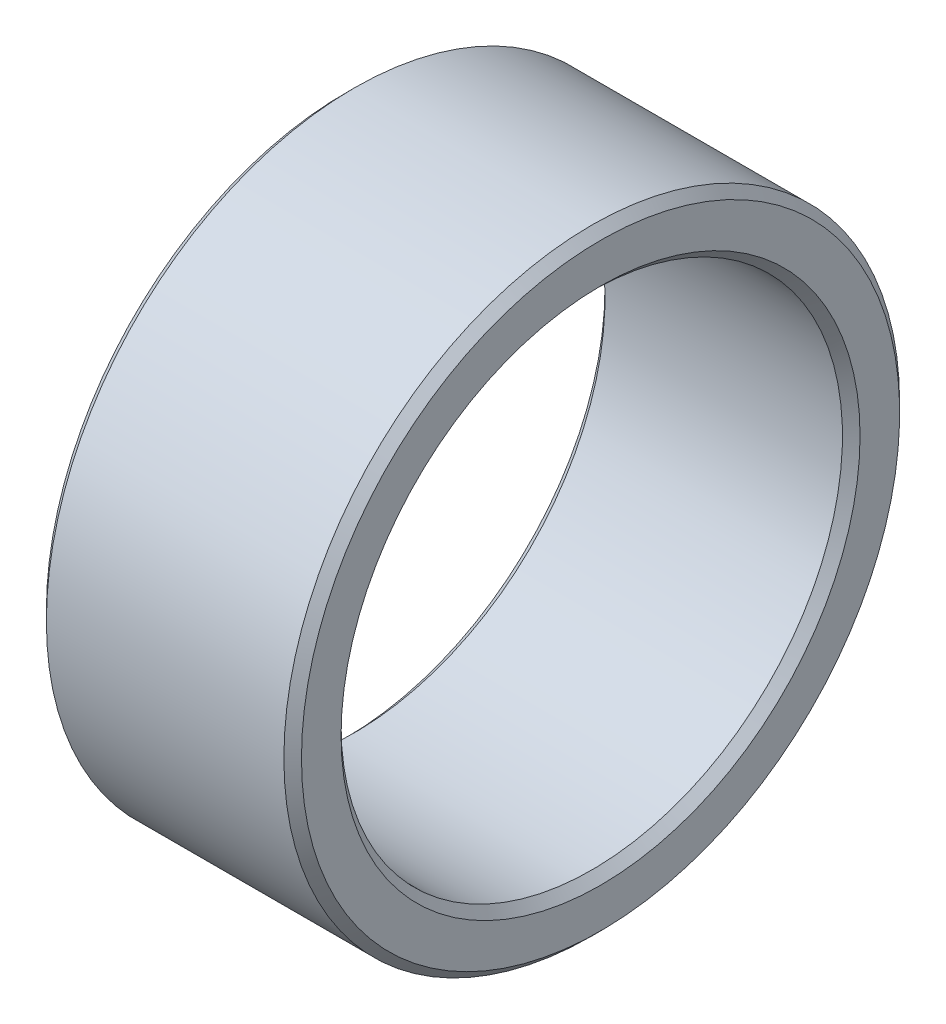
ISO-10303-21;
HEADER;
FILE_DESCRIPTION(('STEP AP214'),'2;1');
FILE_NAME('part.step','',(''),(''),'','','');
FILE_SCHEMA(('AUTOMOTIVE_DESIGN { 1 0 10303 214 1 1 1 1 }'));
ENDSEC;
DATA;
#1=APPLICATION_CONTEXT('core data for automotive mechanical design processes');
#2=APPLICATION_PROTOCOL_DEFINITION('international standard','automotive_design',2000,#1);
#3=PRODUCT_CONTEXT('',#1,'mechanical');
#4=PRODUCT('Part','Part','',(#3));
#5=PRODUCT_RELATED_PRODUCT_CATEGORY('part','',(#4));
#6=PRODUCT_DEFINITION_FORMATION('','',#4);
#7=PRODUCT_DEFINITION_CONTEXT('part definition',#1,'design');
#8=PRODUCT_DEFINITION('design','',#6,#7);
#9=PRODUCT_DEFINITION_SHAPE('','',#8);
#10=(LENGTH_UNIT() NAMED_UNIT(*) SI_UNIT(.MILLI.,.METRE.));
#11=(NAMED_UNIT(*) PLANE_ANGLE_UNIT() SI_UNIT($,.RADIAN.));
#12=(NAMED_UNIT(*) SI_UNIT($,.STERADIAN.) SOLID_ANGLE_UNIT());
#13=UNCERTAINTY_MEASURE_WITH_UNIT(LENGTH_MEASURE(1.E-05),#10,'distance_accuracy_value','');
#14=(GEOMETRIC_REPRESENTATION_CONTEXT(3) GLOBAL_UNCERTAINTY_ASSIGNED_CONTEXT((#13)) GLOBAL_UNIT_ASSIGNED_CONTEXT((#10,
#11,#12)) REPRESENTATION_CONTEXT('',''));
#15=CARTESIAN_POINT('',(0.,0.,0.));
#16=DIRECTION('',(0.,0.,1.));
#17=DIRECTION('',(1.,0.,0.));
#18=AXIS2_PLACEMENT_3D('',#15,#16,#17);
#19=CARTESIAN_POINT('',(0.,0.,0.));
#20=DIRECTION('',(-1.,0.,0.));
#21=DIRECTION('',(0.,0.,1.));
#22=AXIS2_PLACEMENT_3D('',#19,#20,#21);
#23=CYLINDRICAL_SURFACE('',#22,10.5);
#24=CARTESIAN_POINT('',(0.3,0.,0.));
#25=DIRECTION('',(-1.,0.,0.));
#26=DIRECTION('',(0.,0.,1.));
#27=AXIS2_PLACEMENT_3D('',#24,#25,#26);
#28=CIRCLE('',#27,10.5);
#29=CARTESIAN_POINT('',(0.3,0.,10.5));
#30=VERTEX_POINT('',#29);
#31=EDGE_CURVE('E60',#30,#30,#28,.T.);
#32=ORIENTED_EDGE('',*,*,#31,.F.);
#33=EDGE_LOOP('',(#32));
#34=FACE_BOUND('',#33,.T.);
#35=CARTESIAN_POINT('',(8.4,0.,0.));
#36=DIRECTION('',(-1.,0.,0.));
#37=DIRECTION('',(0.,0.,1.));
#38=AXIS2_PLACEMENT_3D('',#35,#36,#37);
#39=CIRCLE('',#38,10.5);
#40=CARTESIAN_POINT('',(8.4,0.,10.5));
#41=VERTEX_POINT('',#40);
#42=EDGE_CURVE('E10',#41,#41,#39,.T.);
#43=ORIENTED_EDGE('',*,*,#42,.T.);
#44=EDGE_LOOP('',(#43));
#45=FACE_BOUND('',#44,.T.);
#46=ADVANCED_FACE('F32',(#34,#45),#23,.T.);
#47=CARTESIAN_POINT('',(8.7,0.,0.));
#48=DIRECTION('',(-1.,0.,0.));
#49=DIRECTION('',(0.,0.,1.));
#50=AXIS2_PLACEMENT_3D('',#47,#48,#49);
#51=CONICAL_SURFACE('',#50,10.2,0.785398163397448);
#52=ORIENTED_EDGE('',*,*,#42,.F.);
#53=EDGE_LOOP('',(#52));
#54=FACE_BOUND('',#53,.T.);
#55=CARTESIAN_POINT('',(8.7,0.,0.));
#56=DIRECTION('',(-1.,0.,0.));
#57=DIRECTION('',(0.,0.,1.));
#58=AXIS2_PLACEMENT_3D('',#55,#56,#57);
#59=CIRCLE('',#58,10.2);
#60=CARTESIAN_POINT('',(8.7,0.,10.2));
#61=VERTEX_POINT('',#60);
#62=EDGE_CURVE('E38',#61,#61,#59,.T.);
#63=ORIENTED_EDGE('',*,*,#62,.T.);
#64=EDGE_LOOP('',(#63));
#65=FACE_BOUND('',#64,.T.);
#66=ADVANCED_FACE('F67',(#54,#65),#51,.T.);
#67=CARTESIAN_POINT('',(8.7,10.2,0.));
#68=DIRECTION('',(-1.,0.,0.));
#69=DIRECTION('',(0.,0.,1.));
#70=AXIS2_PLACEMENT_3D('',#67,#68,#69);
#71=PLANE('',#70);
#72=ORIENTED_EDGE('',*,*,#62,.F.);
#73=EDGE_LOOP('',(#72));
#74=FACE_BOUND('',#73,.T.);
#75=CARTESIAN_POINT('',(8.7,0.,0.));
#76=DIRECTION('',(-1.,0.,0.));
#77=DIRECTION('',(0.,0.,1.));
#78=AXIS2_PLACEMENT_3D('',#75,#76,#77);
#79=CIRCLE('',#78,8.85);
#80=CARTESIAN_POINT('',(8.7,0.,8.85));
#81=VERTEX_POINT('',#80);
#82=EDGE_CURVE('E42',#81,#81,#79,.T.);
#83=ORIENTED_EDGE('',*,*,#82,.T.);
#84=EDGE_LOOP('',(#83));
#85=FACE_BOUND('',#84,.T.);
#86=ADVANCED_FACE('F71',(#74,#85),#71,.F.);
#87=CARTESIAN_POINT('',(8.4,0.,0.));
#88=DIRECTION('',(1.,0.,0.));
#89=DIRECTION('',(0.,0.,-1.));
#90=AXIS2_PLACEMENT_3D('',#87,#88,#89);
#91=CONICAL_SURFACE('',#90,8.55,0.785398163397448);
#92=ORIENTED_EDGE('',*,*,#82,.F.);
#93=EDGE_LOOP('',(#92));
#94=FACE_BOUND('',#93,.T.);
#95=CARTESIAN_POINT('',(8.4,0.,0.));
#96=DIRECTION('',(-1.,0.,0.));
#97=DIRECTION('',(0.,0.,1.));
#98=AXIS2_PLACEMENT_3D('',#95,#96,#97);
#99=CIRCLE('',#98,8.55);
#100=CARTESIAN_POINT('',(8.4,0.,8.55));
#101=VERTEX_POINT('',#100);
#102=EDGE_CURVE('E46',#101,#101,#99,.T.);
#103=ORIENTED_EDGE('',*,*,#102,.T.);
#104=EDGE_LOOP('',(#103));
#105=FACE_BOUND('',#104,.T.);
#106=ADVANCED_FACE('F76',(#94,#105),#91,.F.);
#107=CARTESIAN_POINT('',(0.,0.,0.));
#108=DIRECTION('',(-1.,0.,0.));
#109=DIRECTION('',(0.,0.,1.));
#110=AXIS2_PLACEMENT_3D('',#107,#108,#109);
#111=CYLINDRICAL_SURFACE('',#110,8.55);
#112=ORIENTED_EDGE('',*,*,#102,.F.);
#113=EDGE_LOOP('',(#112));
#114=FACE_BOUND('',#113,.T.);
#115=CARTESIAN_POINT('',(0.3,0.,0.));
#116=DIRECTION('',(-1.,0.,0.));
#117=DIRECTION('',(0.,0.,1.));
#118=AXIS2_PLACEMENT_3D('',#115,#116,#117);
#119=CIRCLE('',#118,8.55);
#120=CARTESIAN_POINT('',(0.3,0.,8.55));
#121=VERTEX_POINT('',#120);
#122=EDGE_CURVE('E51',#121,#121,#119,.T.);
#123=ORIENTED_EDGE('',*,*,#122,.T.);
#124=EDGE_LOOP('',(#123));
#125=FACE_BOUND('',#124,.T.);
#126=ADVANCED_FACE('F82',(#114,#125),#111,.F.);
#127=CARTESIAN_POINT('',(0.,0.,0.));
#128=DIRECTION('',(-1.,0.,0.));
#129=DIRECTION('',(0.,0.,1.));
#130=AXIS2_PLACEMENT_3D('',#127,#128,#129);
#131=CONICAL_SURFACE('',#130,8.85,0.785398163397448);
#132=ORIENTED_EDGE('',*,*,#122,.F.);
#133=EDGE_LOOP('',(#132));
#134=FACE_BOUND('',#133,.T.);
#135=CARTESIAN_POINT('',(0.,0.,0.));
#136=DIRECTION('',(-1.,0.,0.));
#137=DIRECTION('',(0.,0.,1.));
#138=AXIS2_PLACEMENT_3D('',#135,#136,#137);
#139=CIRCLE('',#138,8.85);
#140=CARTESIAN_POINT('',(0.,0.,8.85));
#141=VERTEX_POINT('',#140);
#142=EDGE_CURVE('E54',#141,#141,#139,.T.);
#143=ORIENTED_EDGE('',*,*,#142,.T.);
#144=EDGE_LOOP('',(#143));
#145=FACE_BOUND('',#144,.T.);
#146=ADVANCED_FACE('F86',(#134,#145),#131,.F.);
#147=CARTESIAN_POINT('',(0.,10.2,0.));
#148=DIRECTION('',(1.,0.,0.));
#149=DIRECTION('',(0.,0.,-1.));
#150=AXIS2_PLACEMENT_3D('',#147,#148,#149);
#151=PLANE('',#150);
#152=ORIENTED_EDGE('',*,*,#142,.F.);
#153=EDGE_LOOP('',(#152));
#154=FACE_BOUND('',#153,.T.);
#155=CARTESIAN_POINT('',(0.,0.,0.));
#156=DIRECTION('',(-1.,0.,0.));
#157=DIRECTION('',(0.,0.,1.));
#158=AXIS2_PLACEMENT_3D('',#155,#156,#157);
#159=CIRCLE('',#158,10.2);
#160=CARTESIAN_POINT('',(0.,0.,10.2));
#161=VERTEX_POINT('',#160);
#162=EDGE_CURVE('E57',#161,#161,#159,.T.);
#163=ORIENTED_EDGE('',*,*,#162,.T.);
#164=EDGE_LOOP('',(#163));
#165=FACE_BOUND('',#164,.T.);
#166=ADVANCED_FACE('F90',(#154,#165),#151,.F.);
#167=CARTESIAN_POINT('',(0.3,0.,0.));
#168=DIRECTION('',(1.,0.,0.));
#169=DIRECTION('',(0.,0.,-1.));
#170=AXIS2_PLACEMENT_3D('',#167,#168,#169);
#171=CONICAL_SURFACE('',#170,10.5,0.785398163397448);
#172=ORIENTED_EDGE('',*,*,#162,.F.);
#173=EDGE_LOOP('',(#172));
#174=FACE_BOUND('',#173,.T.);
#175=ORIENTED_EDGE('',*,*,#31,.T.);
#176=EDGE_LOOP('',(#175));
#177=FACE_BOUND('',#176,.T.);
#178=ADVANCED_FACE('F64',(#174,#177),#171,.T.);
#179=CLOSED_SHELL('',(#46,#66,#86,#106,#126,#146,#166,#178));
#180=MANIFOLD_SOLID_BREP('B2',#179);
#181=ADVANCED_BREP_SHAPE_REPRESENTATION('',(#18,#180),#14);
#182=SHAPE_DEFINITION_REPRESENTATION(#9,#181);
ENDSEC;
END-ISO-10303-21;
